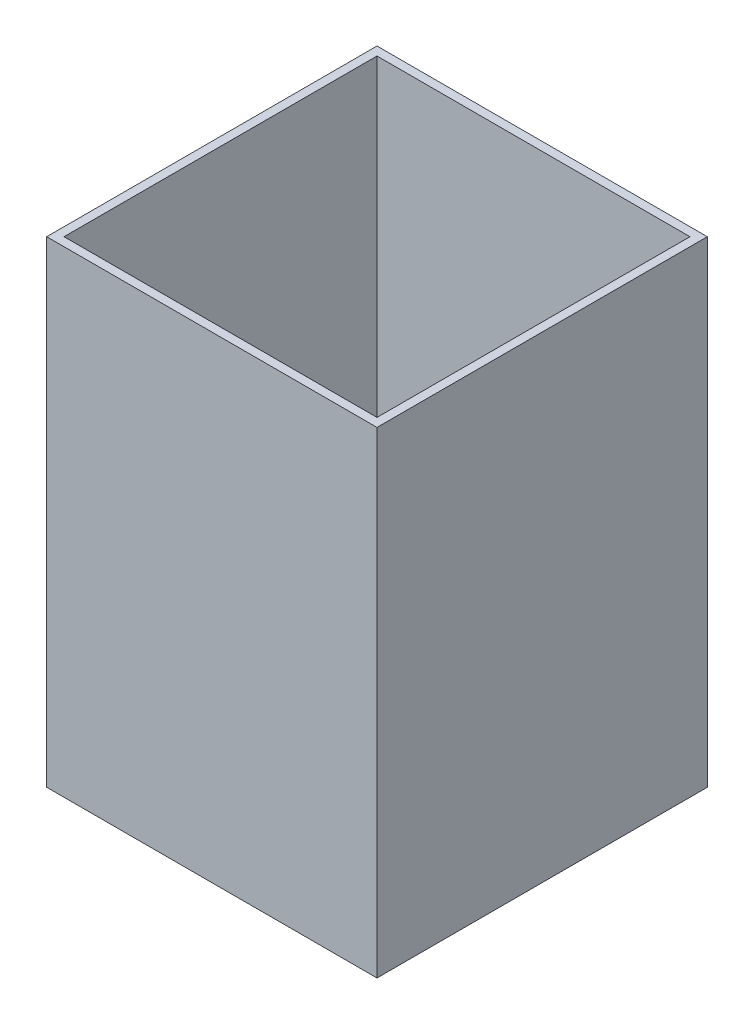
ISO-10303-21;
HEADER;
FILE_DESCRIPTION(('STEP AP214'),'2;1');
FILE_NAME('part.step','',(''),(''),'','','');
FILE_SCHEMA(('AUTOMOTIVE_DESIGN { 1 0 10303 214 1 1 1 1 }'));
ENDSEC;
DATA;
#1=APPLICATION_CONTEXT('core data for automotive mechanical design processes');
#2=APPLICATION_PROTOCOL_DEFINITION('international standard','automotive_design',2000,#1);
#3=PRODUCT_CONTEXT('',#1,'mechanical');
#4=PRODUCT('Part','Part','',(#3));
#5=PRODUCT_RELATED_PRODUCT_CATEGORY('part','',(#4));
#6=PRODUCT_DEFINITION_FORMATION('','',#4);
#7=PRODUCT_DEFINITION_CONTEXT('part definition',#1,'design');
#8=PRODUCT_DEFINITION('design','',#6,#7);
#9=PRODUCT_DEFINITION_SHAPE('','',#8);
#10=(LENGTH_UNIT() NAMED_UNIT(*) SI_UNIT(.MILLI.,.METRE.));
#11=(NAMED_UNIT(*) PLANE_ANGLE_UNIT() SI_UNIT($,.RADIAN.));
#12=(NAMED_UNIT(*) SI_UNIT($,.STERADIAN.) SOLID_ANGLE_UNIT());
#13=UNCERTAINTY_MEASURE_WITH_UNIT(LENGTH_MEASURE(1.E-05),#10,'distance_accuracy_value','');
#14=(GEOMETRIC_REPRESENTATION_CONTEXT(3) GLOBAL_UNCERTAINTY_ASSIGNED_CONTEXT((#13)) GLOBAL_UNIT_ASSIGNED_CONTEXT((#10,
#11,#12)) REPRESENTATION_CONTEXT('',''));
#15=CARTESIAN_POINT('',(0.,0.,0.));
#16=DIRECTION('',(0.,0.,1.));
#17=DIRECTION('',(1.,0.,0.));
#18=AXIS2_PLACEMENT_3D('',#15,#16,#17);
#19=CARTESIAN_POINT('',(0.,110.,0.));
#20=DIRECTION('',(0.,-1.,0.));
#21=DIRECTION('',(0.,0.,-1.));
#22=AXIS2_PLACEMENT_3D('',#19,#20,#21);
#23=PLANE('',#22);
#24=DIRECTION('',(0.,0.,1.));
#25=VECTOR('',#24,1.);
#26=CARTESIAN_POINT('',(0.,110.,0.));
#27=LINE('',#26,#25);
#28=CARTESIAN_POINT('',(0.,110.,-76.2));
#29=VERTEX_POINT('',#28);
#30=CARTESIAN_POINT('',(0.,110.,0.));
#31=VERTEX_POINT('',#30);
#32=EDGE_CURVE('E142',#29,#31,#27,.T.);
#33=ORIENTED_EDGE('',*,*,#32,.T.);
#34=DIRECTION('',(1.,0.,0.));
#35=VECTOR('',#34,1.);
#36=CARTESIAN_POINT('',(0.,110.,0.));
#37=LINE('',#36,#35);
#38=CARTESIAN_POINT('',(76.2,110.,0.));
#39=VERTEX_POINT('',#38);
#40=EDGE_CURVE('E145',#31,#39,#37,.T.);
#41=ORIENTED_EDGE('',*,*,#40,.T.);
#42=DIRECTION('',(0.,0.,-1.));
#43=VECTOR('',#42,1.);
#44=CARTESIAN_POINT('',(76.2,110.,0.));
#45=LINE('',#44,#43);
#46=CARTESIAN_POINT('',(76.2,110.,-76.2));
#47=VERTEX_POINT('',#46);
#48=EDGE_CURVE('E148',#39,#47,#45,.T.);
#49=ORIENTED_EDGE('',*,*,#48,.T.);
#50=DIRECTION('',(-1.,0.,0.));
#51=VECTOR('',#50,1.);
#52=CARTESIAN_POINT('',(0.,110.,-76.2));
#53=LINE('',#52,#51);
#54=EDGE_CURVE('E150',#47,#29,#53,.T.);
#55=ORIENTED_EDGE('',*,*,#54,.T.);
#56=EDGE_LOOP('',(#33,#41,#49,#55));
#57=FACE_BOUND('',#56,.T.);
#58=DIRECTION('',(0.,0.,1.));
#59=VECTOR('',#58,1.);
#60=CARTESIAN_POINT('',(2.,110.,-2.));
#61=LINE('',#60,#59);
#62=CARTESIAN_POINT('',(2.,110.,-74.2));
#63=VERTEX_POINT('',#62);
#64=CARTESIAN_POINT('',(2.,110.,-2.));
#65=VERTEX_POINT('',#64);
#66=EDGE_CURVE('E106',#63,#65,#61,.T.);
#67=ORIENTED_EDGE('',*,*,#66,.F.);
#68=DIRECTION('',(-1.,0.,0.));
#69=VECTOR('',#68,1.);
#70=CARTESIAN_POINT('',(2.,110.,-74.2));
#71=LINE('',#70,#69);
#72=CARTESIAN_POINT('',(74.2,110.,-74.2));
#73=VERTEX_POINT('',#72);
#74=EDGE_CURVE('E128',#73,#63,#71,.T.);
#75=ORIENTED_EDGE('',*,*,#74,.F.);
#76=DIRECTION('',(0.,0.,-1.));
#77=VECTOR('',#76,1.);
#78=CARTESIAN_POINT('',(74.2,110.,-2.));
#79=LINE('',#78,#77);
#80=CARTESIAN_POINT('',(74.2,110.,-2.));
#81=VERTEX_POINT('',#80);
#82=EDGE_CURVE('E126',#81,#73,#79,.T.);
#83=ORIENTED_EDGE('',*,*,#82,.F.);
#84=DIRECTION('',(1.,0.,0.));
#85=VECTOR('',#84,1.);
#86=CARTESIAN_POINT('',(2.,110.,-2.));
#87=LINE('',#86,#85);
#88=EDGE_CURVE('E114',#65,#81,#87,.T.);
#89=ORIENTED_EDGE('',*,*,#88,.F.);
#90=EDGE_LOOP('',(#67,#75,#83,#89));
#91=FACE_BOUND('',#90,.T.);
#92=ADVANCED_FACE('F41',(#57,#91),#23,.F.);
#93=CARTESIAN_POINT('',(0.,0.,0.));
#94=DIRECTION('',(0.,-1.,0.));
#95=DIRECTION('',(0.,0.,-1.));
#96=AXIS2_PLACEMENT_3D('',#93,#94,#95);
#97=PLANE('',#96);
#98=DIRECTION('',(0.,0.,1.));
#99=VECTOR('',#98,1.);
#100=CARTESIAN_POINT('',(0.,0.,0.));
#101=LINE('',#100,#99);
#102=CARTESIAN_POINT('',(0.,0.,-76.2));
#103=VERTEX_POINT('',#102);
#104=CARTESIAN_POINT('',(0.,0.,0.));
#105=VERTEX_POINT('',#104);
#106=EDGE_CURVE('E122',#103,#105,#101,.T.);
#107=ORIENTED_EDGE('',*,*,#106,.F.);
#108=DIRECTION('',(-1.,0.,0.));
#109=VECTOR('',#108,1.);
#110=CARTESIAN_POINT('',(0.,0.,-76.2));
#111=LINE('',#110,#109);
#112=CARTESIAN_POINT('',(76.2,0.,-76.2));
#113=VERTEX_POINT('',#112);
#114=EDGE_CURVE('E146',#113,#103,#111,.T.);
#115=ORIENTED_EDGE('',*,*,#114,.F.);
#116=DIRECTION('',(0.,0.,-1.));
#117=VECTOR('',#116,1.);
#118=CARTESIAN_POINT('',(76.2,0.,0.));
#119=LINE('',#118,#117);
#120=CARTESIAN_POINT('',(76.2,0.,0.));
#121=VERTEX_POINT('',#120);
#122=EDGE_CURVE('E157',#121,#113,#119,.T.);
#123=ORIENTED_EDGE('',*,*,#122,.F.);
#124=DIRECTION('',(1.,0.,0.));
#125=VECTOR('',#124,1.);
#126=CARTESIAN_POINT('',(0.,0.,0.));
#127=LINE('',#126,#125);
#128=EDGE_CURVE('E155',#105,#121,#127,.T.);
#129=ORIENTED_EDGE('',*,*,#128,.F.);
#130=EDGE_LOOP('',(#107,#115,#123,#129));
#131=FACE_BOUND('',#130,.T.);
#132=DIRECTION('',(-1.,0.,0.));
#133=VECTOR('',#132,1.);
#134=CARTESIAN_POINT('',(2.,0.,-74.2));
#135=LINE('',#134,#133);
#136=CARTESIAN_POINT('',(74.2,0.,-74.2));
#137=VERTEX_POINT('',#136);
#138=CARTESIAN_POINT('',(2.,0.,-74.2));
#139=VERTEX_POINT('',#138);
#140=EDGE_CURVE('E115',#137,#139,#135,.T.);
#141=ORIENTED_EDGE('',*,*,#140,.T.);
#142=DIRECTION('',(0.,0.,1.));
#143=VECTOR('',#142,1.);
#144=CARTESIAN_POINT('',(2.,0.,-2.));
#145=LINE('',#144,#143);
#146=CARTESIAN_POINT('',(2.,0.,-2.));
#147=VERTEX_POINT('',#146);
#148=EDGE_CURVE('E64',#139,#147,#145,.T.);
#149=ORIENTED_EDGE('',*,*,#148,.T.);
#150=DIRECTION('',(1.,0.,0.));
#151=VECTOR('',#150,1.);
#152=CARTESIAN_POINT('',(2.,0.,-2.));
#153=LINE('',#152,#151);
#154=CARTESIAN_POINT('',(74.2,0.,-2.));
#155=VERTEX_POINT('',#154);
#156=EDGE_CURVE('E121',#147,#155,#153,.T.);
#157=ORIENTED_EDGE('',*,*,#156,.T.);
#158=DIRECTION('',(0.,0.,-1.));
#159=VECTOR('',#158,1.);
#160=CARTESIAN_POINT('',(74.2,0.,-2.));
#161=LINE('',#160,#159);
#162=EDGE_CURVE('E134',#155,#137,#161,.T.);
#163=ORIENTED_EDGE('',*,*,#162,.T.);
#164=EDGE_LOOP('',(#141,#149,#157,#163));
#165=FACE_BOUND('',#164,.T.);
#166=ADVANCED_FACE('F175',(#131,#165),#97,.T.);
#167=CARTESIAN_POINT('',(0.,110.,0.));
#168=DIRECTION('',(1.,0.,0.));
#169=DIRECTION('',(0.,0.,-1.));
#170=AXIS2_PLACEMENT_3D('',#167,#168,#169);
#171=PLANE('',#170);
#172=ORIENTED_EDGE('',*,*,#106,.T.);
#173=DIRECTION('',(0.,-1.,0.));
#174=VECTOR('',#173,1.);
#175=CARTESIAN_POINT('',(0.,110.,0.));
#176=LINE('',#175,#174);
#177=EDGE_CURVE('E11',#31,#105,#176,.T.);
#178=ORIENTED_EDGE('',*,*,#177,.F.);
#179=ORIENTED_EDGE('',*,*,#32,.F.);
#180=DIRECTION('',(0.,-1.,0.));
#181=VECTOR('',#180,1.);
#182=CARTESIAN_POINT('',(0.,110.,-76.2));
#183=LINE('',#182,#181);
#184=EDGE_CURVE('E152',#29,#103,#183,.T.);
#185=ORIENTED_EDGE('',*,*,#184,.T.);
#186=EDGE_LOOP('',(#172,#178,#179,#185));
#187=FACE_BOUND('',#186,.T.);
#188=ADVANCED_FACE('F43',(#187),#171,.F.);
#189=CARTESIAN_POINT('',(0.,110.,0.));
#190=DIRECTION('',(0.,0.,-1.));
#191=DIRECTION('',(-1.,0.,0.));
#192=AXIS2_PLACEMENT_3D('',#189,#190,#191);
#193=PLANE('',#192);
#194=ORIENTED_EDGE('',*,*,#128,.T.);
#195=DIRECTION('',(0.,-1.,0.));
#196=VECTOR('',#195,1.);
#197=CARTESIAN_POINT('',(76.2,110.,0.));
#198=LINE('',#197,#196);
#199=EDGE_CURVE('E49',#39,#121,#198,.T.);
#200=ORIENTED_EDGE('',*,*,#199,.F.);
#201=ORIENTED_EDGE('',*,*,#40,.F.);
#202=ORIENTED_EDGE('',*,*,#177,.T.);
#203=EDGE_LOOP('',(#194,#200,#201,#202));
#204=FACE_BOUND('',#203,.T.);
#205=ADVANCED_FACE('F185',(#204),#193,.F.);
#206=CARTESIAN_POINT('',(76.2,110.,0.));
#207=DIRECTION('',(-1.,0.,0.));
#208=DIRECTION('',(0.,0.,1.));
#209=AXIS2_PLACEMENT_3D('',#206,#207,#208);
#210=PLANE('',#209);
#211=ORIENTED_EDGE('',*,*,#122,.T.);
#212=DIRECTION('',(0.,-1.,0.));
#213=VECTOR('',#212,1.);
#214=CARTESIAN_POINT('',(76.2,110.,-76.2));
#215=LINE('',#214,#213);
#216=EDGE_CURVE('E162',#47,#113,#215,.T.);
#217=ORIENTED_EDGE('',*,*,#216,.F.);
#218=ORIENTED_EDGE('',*,*,#48,.F.);
#219=ORIENTED_EDGE('',*,*,#199,.T.);
#220=EDGE_LOOP('',(#211,#217,#218,#219));
#221=FACE_BOUND('',#220,.T.);
#222=ADVANCED_FACE('F169',(#221),#210,.F.);
#223=CARTESIAN_POINT('',(0.,110.,-76.2));
#224=DIRECTION('',(0.,0.,1.));
#225=DIRECTION('',(1.,0.,0.));
#226=AXIS2_PLACEMENT_3D('',#223,#224,#225);
#227=PLANE('',#226);
#228=ORIENTED_EDGE('',*,*,#114,.T.);
#229=ORIENTED_EDGE('',*,*,#184,.F.);
#230=ORIENTED_EDGE('',*,*,#54,.F.);
#231=ORIENTED_EDGE('',*,*,#216,.T.);
#232=EDGE_LOOP('',(#228,#229,#230,#231));
#233=FACE_BOUND('',#232,.T.);
#234=ADVANCED_FACE('F179',(#233),#227,.F.);
#235=CARTESIAN_POINT('',(2.,110.,-2.));
#236=DIRECTION('',(1.,0.,0.));
#237=DIRECTION('',(0.,0.,-1.));
#238=AXIS2_PLACEMENT_3D('',#235,#236,#237);
#239=PLANE('',#238);
#240=ORIENTED_EDGE('',*,*,#148,.F.);
#241=DIRECTION('',(0.,-1.,0.));
#242=VECTOR('',#241,1.);
#243=CARTESIAN_POINT('',(2.,110.,-74.2));
#244=LINE('',#243,#242);
#245=EDGE_CURVE('E110',#63,#139,#244,.T.);
#246=ORIENTED_EDGE('',*,*,#245,.F.);
#247=ORIENTED_EDGE('',*,*,#66,.T.);
#248=DIRECTION('',(0.,-1.,0.));
#249=VECTOR('',#248,1.);
#250=CARTESIAN_POINT('',(2.,110.,-2.));
#251=LINE('',#250,#249);
#252=EDGE_CURVE('E109',#65,#147,#251,.T.);
#253=ORIENTED_EDGE('',*,*,#252,.T.);
#254=EDGE_LOOP('',(#240,#246,#247,#253));
#255=FACE_BOUND('',#254,.T.);
#256=ADVANCED_FACE('F108',(#255),#239,.T.);
#257=CARTESIAN_POINT('',(2.,110.,-2.));
#258=DIRECTION('',(0.,0.,-1.));
#259=DIRECTION('',(-1.,0.,0.));
#260=AXIS2_PLACEMENT_3D('',#257,#258,#259);
#261=PLANE('',#260);
#262=ORIENTED_EDGE('',*,*,#156,.F.);
#263=ORIENTED_EDGE('',*,*,#252,.F.);
#264=ORIENTED_EDGE('',*,*,#88,.T.);
#265=DIRECTION('',(0.,-1.,0.));
#266=VECTOR('',#265,1.);
#267=CARTESIAN_POINT('',(74.2,110.,-2.));
#268=LINE('',#267,#266);
#269=EDGE_CURVE('E123',#81,#155,#268,.T.);
#270=ORIENTED_EDGE('',*,*,#269,.T.);
#271=EDGE_LOOP('',(#262,#263,#264,#270));
#272=FACE_BOUND('',#271,.T.);
#273=ADVANCED_FACE('F118',(#272),#261,.T.);
#274=CARTESIAN_POINT('',(74.2,110.,-2.));
#275=DIRECTION('',(-1.,0.,0.));
#276=DIRECTION('',(0.,0.,1.));
#277=AXIS2_PLACEMENT_3D('',#274,#275,#276);
#278=PLANE('',#277);
#279=ORIENTED_EDGE('',*,*,#162,.F.);
#280=ORIENTED_EDGE('',*,*,#269,.F.);
#281=ORIENTED_EDGE('',*,*,#82,.T.);
#282=DIRECTION('',(0.,-1.,0.));
#283=VECTOR('',#282,1.);
#284=CARTESIAN_POINT('',(74.2,110.,-74.2));
#285=LINE('',#284,#283);
#286=EDGE_CURVE('E56',#73,#137,#285,.T.);
#287=ORIENTED_EDGE('',*,*,#286,.T.);
#288=EDGE_LOOP('',(#279,#280,#281,#287));
#289=FACE_BOUND('',#288,.T.);
#290=ADVANCED_FACE('F208',(#289),#278,.T.);
#291=CARTESIAN_POINT('',(2.,110.,-74.2));
#292=DIRECTION('',(0.,0.,1.));
#293=DIRECTION('',(1.,0.,0.));
#294=AXIS2_PLACEMENT_3D('',#291,#292,#293);
#295=PLANE('',#294);
#296=ORIENTED_EDGE('',*,*,#140,.F.);
#297=ORIENTED_EDGE('',*,*,#286,.F.);
#298=ORIENTED_EDGE('',*,*,#74,.T.);
#299=ORIENTED_EDGE('',*,*,#245,.T.);
#300=EDGE_LOOP('',(#296,#297,#298,#299));
#301=FACE_BOUND('',#300,.T.);
#302=ADVANCED_FACE('F212',(#301),#295,.T.);
#303=CLOSED_SHELL('',(#92,#166,#188,#205,#222,#234,#256,#273,#290,#302));
#304=MANIFOLD_SOLID_BREP('B2',#303);
#305=ADVANCED_BREP_SHAPE_REPRESENTATION('',(#18,#304),#14);
#306=SHAPE_DEFINITION_REPRESENTATION(#9,#305);
ENDSEC;
END-ISO-10303-21;
